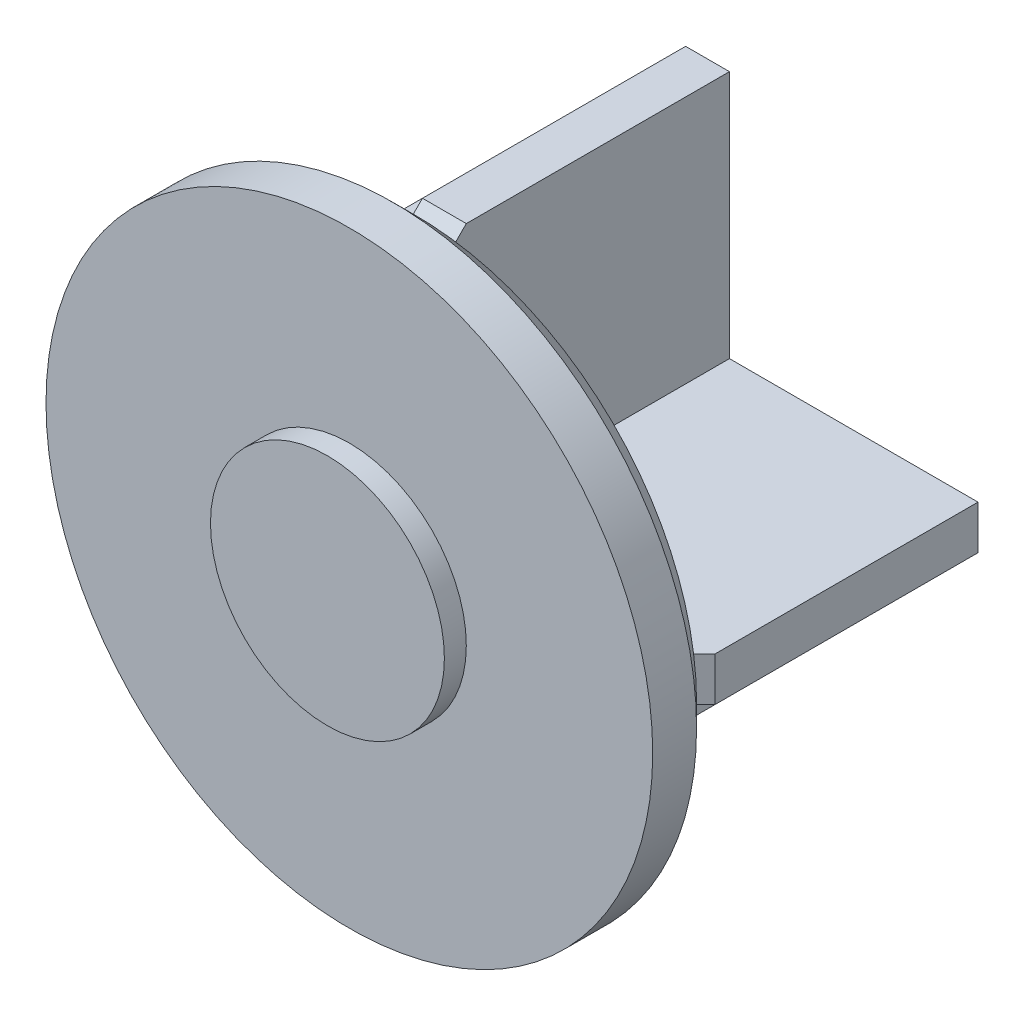
ISO-10303-21;
HEADER;
FILE_DESCRIPTION(('STEP AP214'),'2;1');
FILE_NAME('part.step','',(''),(''),'','','');
FILE_SCHEMA(('AUTOMOTIVE_DESIGN { 1 0 10303 214 1 1 1 1 }'));
ENDSEC;
DATA;
#1=APPLICATION_CONTEXT('core data for automotive mechanical design processes');
#2=APPLICATION_PROTOCOL_DEFINITION('international standard','automotive_design',2000,#1);
#3=PRODUCT_CONTEXT('',#1,'mechanical');
#4=PRODUCT('Part','Part','',(#3));
#5=PRODUCT_RELATED_PRODUCT_CATEGORY('part','',(#4));
#6=PRODUCT_DEFINITION_FORMATION('','',#4);
#7=PRODUCT_DEFINITION_CONTEXT('part definition',#1,'design');
#8=PRODUCT_DEFINITION('design','',#6,#7);
#9=PRODUCT_DEFINITION_SHAPE('','',#8);
#10=(LENGTH_UNIT() NAMED_UNIT(*) SI_UNIT(.MILLI.,.METRE.));
#11=(NAMED_UNIT(*) PLANE_ANGLE_UNIT() SI_UNIT($,.RADIAN.));
#12=(NAMED_UNIT(*) SI_UNIT($,.STERADIAN.) SOLID_ANGLE_UNIT());
#13=UNCERTAINTY_MEASURE_WITH_UNIT(LENGTH_MEASURE(1.E-05),#10,'distance_accuracy_value','');
#14=(GEOMETRIC_REPRESENTATION_CONTEXT(3) GLOBAL_UNCERTAINTY_ASSIGNED_CONTEXT((#13)) GLOBAL_UNIT_ASSIGNED_CONTEXT((#10,
#11,#12)) REPRESENTATION_CONTEXT('',''));
#15=CARTESIAN_POINT('',(0.,0.,0.));
#16=DIRECTION('',(0.,0.,1.));
#17=DIRECTION('',(1.,0.,0.));
#18=AXIS2_PLACEMENT_3D('',#15,#16,#17);
#19=CARTESIAN_POINT('',(0.,0.,-4.5));
#20=DIRECTION('',(0.,0.,1.));
#21=DIRECTION('',(1.,0.,0.));
#22=AXIS2_PLACEMENT_3D('',#19,#20,#21);
#23=PLANE('',#22);
#24=CARTESIAN_POINT('',(0.,0.,-4.5));
#25=DIRECTION('',(0.,0.,1.));
#26=DIRECTION('',(1.,0.,0.));
#27=AXIS2_PLACEMENT_3D('',#24,#25,#26);
#28=CIRCLE('',#27,38.5);
#29=CARTESIAN_POINT('',(38.5,0.,-4.5));
#30=VERTEX_POINT('',#29);
#31=EDGE_CURVE('E227',#30,#30,#28,.F.);
#32=ORIENTED_EDGE('',*,*,#31,.T.);
#33=EDGE_LOOP('',(#32));
#34=FACE_BOUND('',#33,.T.);
#35=DIRECTION('',(-1.,0.,0.));
#36=VECTOR('',#35,1.);
#37=CARTESIAN_POINT('',(41.5,-33.0000000000002,-4.5));
#38=LINE('',#37,#36);
#39=CARTESIAN_POINT('',(3.,-33.,-4.5));
#40=VERTEX_POINT('',#39);
#41=CARTESIAN_POINT('',(-3.,-33.,-4.5));
#42=VERTEX_POINT('',#41);
#43=EDGE_CURVE('E147',#40,#42,#38,.T.);
#44=ORIENTED_EDGE('',*,*,#43,.F.);
#45=DIRECTION('',(0.,-1.,0.));
#46=VECTOR('',#45,1.);
#47=CARTESIAN_POINT('',(3.,-37.,-4.5));
#48=LINE('',#47,#46);
#49=CARTESIAN_POINT('',(3.,-3.,-4.5));
#50=VERTEX_POINT('',#49);
#51=EDGE_CURVE('E161',#50,#40,#48,.T.);
#52=ORIENTED_EDGE('',*,*,#51,.F.);
#53=DIRECTION('',(-1.,0.,0.));
#54=VECTOR('',#53,1.);
#55=CARTESIAN_POINT('',(37.,-3.,-4.5));
#56=LINE('',#55,#54);
#57=CARTESIAN_POINT('',(33.,-3.,-4.5));
#58=VERTEX_POINT('',#57);
#59=EDGE_CURVE('E172',#58,#50,#56,.T.);
#60=ORIENTED_EDGE('',*,*,#59,.F.);
#61=DIRECTION('',(0.,-1.,0.));
#62=VECTOR('',#61,1.);
#63=CARTESIAN_POINT('',(33.,41.5,-4.5));
#64=LINE('',#63,#62);
#65=CARTESIAN_POINT('',(33.,3.,-4.5));
#66=VERTEX_POINT('',#65);
#67=EDGE_CURVE('E278',#66,#58,#64,.T.);
#68=ORIENTED_EDGE('',*,*,#67,.F.);
#69=DIRECTION('',(1.,0.,0.));
#70=VECTOR('',#69,1.);
#71=CARTESIAN_POINT('',(37.,3.,-4.5));
#72=LINE('',#71,#70);
#73=CARTESIAN_POINT('',(3.,3.,-4.5));
#74=VERTEX_POINT('',#73);
#75=EDGE_CURVE('E177',#74,#66,#72,.T.);
#76=ORIENTED_EDGE('',*,*,#75,.F.);
#77=DIRECTION('',(0.,-1.,0.));
#78=VECTOR('',#77,1.);
#79=CARTESIAN_POINT('',(3.,3.,-4.5));
#80=LINE('',#79,#78);
#81=CARTESIAN_POINT('',(3.,33.,-4.5));
#82=VERTEX_POINT('',#81);
#83=EDGE_CURVE('E235',#82,#74,#80,.T.);
#84=ORIENTED_EDGE('',*,*,#83,.F.);
#85=DIRECTION('',(1.,0.,0.));
#86=VECTOR('',#85,1.);
#87=CARTESIAN_POINT('',(-41.5000000000001,33.0000000000005,-4.5));
#88=LINE('',#87,#86);
#89=CARTESIAN_POINT('',(-3.,33.0000000000001,-4.5));
#90=VERTEX_POINT('',#89);
#91=EDGE_CURVE('E55',#90,#82,#88,.T.);
#92=ORIENTED_EDGE('',*,*,#91,.F.);
#93=DIRECTION('',(0.,1.,0.));
#94=VECTOR('',#93,1.);
#95=CARTESIAN_POINT('',(-3.,3.,-4.5));
#96=LINE('',#95,#94);
#97=CARTESIAN_POINT('',(-3.,3.,-4.5));
#98=VERTEX_POINT('',#97);
#99=EDGE_CURVE('E244',#98,#90,#96,.T.);
#100=ORIENTED_EDGE('',*,*,#99,.F.);
#101=DIRECTION('',(1.,0.,0.));
#102=VECTOR('',#101,1.);
#103=CARTESIAN_POINT('',(-3.,3.,-4.5));
#104=LINE('',#103,#102);
#105=CARTESIAN_POINT('',(-33.,3.,-4.5));
#106=VERTEX_POINT('',#105);
#107=EDGE_CURVE('E246',#106,#98,#104,.T.);
#108=ORIENTED_EDGE('',*,*,#107,.F.);
#109=DIRECTION('',(0.,1.,0.));
#110=VECTOR('',#109,1.);
#111=CARTESIAN_POINT('',(-33.,-41.5,-4.5));
#112=LINE('',#111,#110);
#113=CARTESIAN_POINT('',(-33.,-3.,-4.5));
#114=VERTEX_POINT('',#113);
#115=EDGE_CURVE('E48',#114,#106,#112,.T.);
#116=ORIENTED_EDGE('',*,*,#115,.F.);
#117=DIRECTION('',(-1.,0.,0.));
#118=VECTOR('',#117,1.);
#119=CARTESIAN_POINT('',(-3.,-3.,-4.5));
#120=LINE('',#119,#118);
#121=CARTESIAN_POINT('',(-3.,-3.,-4.5));
#122=VERTEX_POINT('',#121);
#123=EDGE_CURVE('E250',#122,#114,#120,.T.);
#124=ORIENTED_EDGE('',*,*,#123,.F.);
#125=DIRECTION('',(0.,1.,0.));
#126=VECTOR('',#125,1.);
#127=CARTESIAN_POINT('',(-3.,-37.,-4.5));
#128=LINE('',#127,#126);
#129=EDGE_CURVE('E164',#42,#122,#128,.T.);
#130=ORIENTED_EDGE('',*,*,#129,.F.);
#131=EDGE_LOOP('',(#44,#52,#60,#68,#76,#84,#92,#100,#108,#116,#124,#130));
#132=FACE_BOUND('',#131,.T.);
#133=ADVANCED_FACE('F33',(#34,#132),#23,.F.);
#134=CARTESIAN_POINT('',(0.,0.,4.5));
#135=DIRECTION('',(0.,0.,1.));
#136=DIRECTION('',(1.,0.,0.));
#137=AXIS2_PLACEMENT_3D('',#134,#135,#136);
#138=PLANE('',#137);
#139=CARTESIAN_POINT('',(0.,0.,4.5));
#140=DIRECTION('',(0.,0.,1.));
#141=DIRECTION('',(1.,0.,0.));
#142=AXIS2_PLACEMENT_3D('',#139,#140,#141);
#143=CIRCLE('',#142,41.5);
#144=CARTESIAN_POINT('',(41.5,0.,4.5));
#145=VERTEX_POINT('',#144);
#146=EDGE_CURVE('E219',#145,#145,#143,.T.);
#147=ORIENTED_EDGE('',*,*,#146,.T.);
#148=EDGE_LOOP('',(#147));
#149=FACE_BOUND('',#148,.T.);
#150=CARTESIAN_POINT('',(0.,0.,4.5));
#151=DIRECTION('',(0.,0.,1.));
#152=DIRECTION('',(1.,0.,0.));
#153=AXIS2_PLACEMENT_3D('',#150,#151,#152);
#154=CIRCLE('',#153,16.);
#155=CARTESIAN_POINT('',(16.,0.,4.5));
#156=VERTEX_POINT('',#155);
#157=EDGE_CURVE('E215',#156,#156,#154,.T.);
#158=ORIENTED_EDGE('',*,*,#157,.F.);
#159=EDGE_LOOP('',(#158));
#160=FACE_BOUND('',#159,.T.);
#161=ADVANCED_FACE('F349',(#149,#160),#138,.T.);
#162=CARTESIAN_POINT('',(0.,0.,4.5));
#163=DIRECTION('',(0.,0.,-1.));
#164=DIRECTION('',(-1.,0.,0.));
#165=AXIS2_PLACEMENT_3D('',#162,#163,#164);
#166=CYLINDRICAL_SURFACE('',#165,41.5);
#167=CARTESIAN_POINT('',(0.,0.,-1.49999999999997));
#168=DIRECTION('',(0.,0.,1.));
#169=DIRECTION('',(1.,0.,0.));
#170=AXIS2_PLACEMENT_3D('',#167,#168,#169);
#171=CIRCLE('',#170,41.5);
#172=CARTESIAN_POINT('',(41.5,0.,-1.49999999999997));
#173=VERTEX_POINT('',#172);
#174=EDGE_CURVE('E224',#173,#173,#171,.T.);
#175=ORIENTED_EDGE('',*,*,#174,.T.);
#176=EDGE_LOOP('',(#175));
#177=FACE_BOUND('',#176,.T.);
#178=ORIENTED_EDGE('',*,*,#146,.F.);
#179=EDGE_LOOP('',(#178));
#180=FACE_BOUND('',#179,.T.);
#181=ADVANCED_FACE('F355',(#177,#180),#166,.T.);
#182=CARTESIAN_POINT('',(0.,0.,-1.49999999999997));
#183=DIRECTION('',(0.,0.,1.));
#184=DIRECTION('',(1.,0.,0.));
#185=AXIS2_PLACEMENT_3D('',#182,#183,#184);
#186=CONICAL_SURFACE('',#185,41.5,0.785398163397448);
#187=ORIENTED_EDGE('',*,*,#31,.F.);
#188=EDGE_LOOP('',(#187));
#189=FACE_BOUND('',#188,.T.);
#190=ORIENTED_EDGE('',*,*,#174,.F.);
#191=EDGE_LOOP('',(#190));
#192=FACE_BOUND('',#191,.T.);
#193=ADVANCED_FACE('F35',(#189,#192),#186,.T.);
#194=CARTESIAN_POINT('',(0.,0.,7.5));
#195=DIRECTION('',(0.,0.,-1.));
#196=DIRECTION('',(-1.,0.,0.));
#197=AXIS2_PLACEMENT_3D('',#194,#195,#196);
#198=CYLINDRICAL_SURFACE('',#197,16.);
#199=CARTESIAN_POINT('',(0.,0.,7.5));
#200=DIRECTION('',(0.,0.,1.));
#201=DIRECTION('',(1.,0.,0.));
#202=AXIS2_PLACEMENT_3D('',#199,#200,#201);
#203=CIRCLE('',#202,16.);
#204=CARTESIAN_POINT('',(16.,0.,7.5));
#205=VERTEX_POINT('',#204);
#206=EDGE_CURVE('E216',#205,#205,#203,.T.);
#207=ORIENTED_EDGE('',*,*,#206,.F.);
#208=EDGE_LOOP('',(#207));
#209=FACE_BOUND('',#208,.T.);
#210=ORIENTED_EDGE('',*,*,#157,.T.);
#211=EDGE_LOOP('',(#210));
#212=FACE_BOUND('',#211,.T.);
#213=ADVANCED_FACE('F364',(#209,#212),#198,.T.);
#214=CARTESIAN_POINT('',(0.,0.,7.5));
#215=DIRECTION('',(0.,0.,1.));
#216=DIRECTION('',(1.,0.,0.));
#217=AXIS2_PLACEMENT_3D('',#214,#215,#216);
#218=PLANE('',#217);
#219=ORIENTED_EDGE('',*,*,#206,.T.);
#220=EDGE_LOOP('',(#219));
#221=FACE_BOUND('',#220,.T.);
#222=ADVANCED_FACE('F373',(#221),#218,.T.);
#223=CARTESIAN_POINT('',(3.,-37.,-44.5));
#224=DIRECTION('',(0.,1.,0.));
#225=DIRECTION('',(0.,0.,1.));
#226=AXIS2_PLACEMENT_3D('',#223,#224,#225);
#227=PLANE('',#226);
#228=DIRECTION('',(0.,0.,1.));
#229=VECTOR('',#228,1.);
#230=CARTESIAN_POINT('',(3.,-37.,-44.5));
#231=LINE('',#230,#229);
#232=CARTESIAN_POINT('',(3.,-37.,-44.5));
#233=VERTEX_POINT('',#232);
#234=CARTESIAN_POINT('',(3.,-37.,-8.5));
#235=VERTEX_POINT('',#234);
#236=EDGE_CURVE('E181',#233,#235,#231,.T.);
#237=ORIENTED_EDGE('',*,*,#236,.T.);
#238=DIRECTION('',(-1.,0.,0.));
#239=VECTOR('',#238,1.);
#240=CARTESIAN_POINT('',(41.5,-37.0000000000001,-8.5));
#241=LINE('',#240,#239);
#242=CARTESIAN_POINT('',(-3.,-37.,-8.5));
#243=VERTEX_POINT('',#242);
#244=EDGE_CURVE('E150',#235,#243,#241,.T.);
#245=ORIENTED_EDGE('',*,*,#244,.T.);
#246=DIRECTION('',(0.,0.,1.));
#247=VECTOR('',#246,1.);
#248=CARTESIAN_POINT('',(-3.,-37.,-44.5));
#249=LINE('',#248,#247);
#250=CARTESIAN_POINT('',(-3.,-37.,-44.5));
#251=VERTEX_POINT('',#250);
#252=EDGE_CURVE('E212',#251,#243,#249,.T.);
#253=ORIENTED_EDGE('',*,*,#252,.F.);
#254=DIRECTION('',(-1.,0.,0.));
#255=VECTOR('',#254,1.);
#256=CARTESIAN_POINT('',(3.,-37.,-44.5));
#257=LINE('',#256,#255);
#258=EDGE_CURVE('E171',#233,#251,#257,.T.);
#259=ORIENTED_EDGE('',*,*,#258,.F.);
#260=EDGE_LOOP('',(#237,#245,#253,#259));
#261=FACE_BOUND('',#260,.T.);
#262=ADVANCED_FACE('F323',(#261),#227,.F.);
#263=CARTESIAN_POINT('',(-3.,-37.,-44.5));
#264=DIRECTION('',(1.,0.,0.));
#265=DIRECTION('',(0.,0.,-1.));
#266=AXIS2_PLACEMENT_3D('',#263,#264,#265);
#267=PLANE('',#266);
#268=ORIENTED_EDGE('',*,*,#252,.T.);
#269=DIRECTION('',(0.,0.707106781186544,0.707106781186551));
#270=VECTOR('',#269,1.);
#271=CARTESIAN_POINT('',(-3.,-55.,-26.5000000000002));
#272=LINE('',#271,#270);
#273=EDGE_CURVE('E288',#243,#42,#272,.T.);
#274=ORIENTED_EDGE('',*,*,#273,.T.);
#275=ORIENTED_EDGE('',*,*,#129,.T.);
#276=DIRECTION('',(0.,0.,1.));
#277=VECTOR('',#276,1.);
#278=CARTESIAN_POINT('',(-3.,-3.,-44.5));
#279=LINE('',#278,#277);
#280=CARTESIAN_POINT('',(-3.,-3.,-44.5));
#281=VERTEX_POINT('',#280);
#282=EDGE_CURVE('E209',#281,#122,#279,.T.);
#283=ORIENTED_EDGE('',*,*,#282,.F.);
#284=DIRECTION('',(0.,1.,0.));
#285=VECTOR('',#284,1.);
#286=CARTESIAN_POINT('',(-3.,-37.,-44.5));
#287=LINE('',#286,#285);
#288=EDGE_CURVE('E175',#251,#281,#287,.T.);
#289=ORIENTED_EDGE('',*,*,#288,.F.);
#290=EDGE_LOOP('',(#268,#274,#275,#283,#289));
#291=FACE_BOUND('',#290,.T.);
#292=ADVANCED_FACE('F320',(#291),#267,.F.);
#293=CARTESIAN_POINT('',(-3.,-3.,-44.5));
#294=DIRECTION('',(0.,1.,0.));
#295=DIRECTION('',(-1.,0.,0.));
#296=AXIS2_PLACEMENT_3D('',#293,#294,#295);
#297=PLANE('',#296);
#298=ORIENTED_EDGE('',*,*,#123,.T.);
#299=DIRECTION('',(-0.707106781186544,0.,-0.707106781186551));
#300=VECTOR('',#299,1.);
#301=CARTESIAN_POINT('',(-38.0000000000002,-3.,-9.50000000000017));
#302=LINE('',#301,#300);
#303=CARTESIAN_POINT('',(-37.,-3.,-8.5));
#304=VERTEX_POINT('',#303);
#305=EDGE_CURVE('E280',#114,#304,#302,.T.);
#306=ORIENTED_EDGE('',*,*,#305,.T.);
#307=DIRECTION('',(0.,0.,1.));
#308=VECTOR('',#307,1.);
#309=CARTESIAN_POINT('',(-37.,-3.,-44.5));
#310=LINE('',#309,#308);
#311=CARTESIAN_POINT('',(-37.,-3.,-44.5));
#312=VERTEX_POINT('',#311);
#313=EDGE_CURVE('E206',#312,#304,#310,.T.);
#314=ORIENTED_EDGE('',*,*,#313,.F.);
#315=DIRECTION('',(-1.,0.,0.));
#316=VECTOR('',#315,1.);
#317=CARTESIAN_POINT('',(-3.,-3.,-44.5));
#318=LINE('',#317,#316);
#319=EDGE_CURVE('E272',#281,#312,#318,.T.);
#320=ORIENTED_EDGE('',*,*,#319,.F.);
#321=ORIENTED_EDGE('',*,*,#282,.T.);
#322=EDGE_LOOP('',(#298,#306,#314,#320,#321));
#323=FACE_BOUND('',#322,.T.);
#324=ADVANCED_FACE('F317',(#323),#297,.F.);
#325=CARTESIAN_POINT('',(-37.,3.,-44.5));
#326=DIRECTION('',(1.,0.,0.));
#327=DIRECTION('',(0.,0.,-1.));
#328=AXIS2_PLACEMENT_3D('',#325,#326,#327);
#329=PLANE('',#328);
#330=ORIENTED_EDGE('',*,*,#313,.T.);
#331=DIRECTION('',(0.,1.,0.));
#332=VECTOR('',#331,1.);
#333=CARTESIAN_POINT('',(-37.,-41.5,-8.5));
#334=LINE('',#333,#332);
#335=CARTESIAN_POINT('',(-37.,3.,-8.5));
#336=VERTEX_POINT('',#335);
#337=EDGE_CURVE('E165',#304,#336,#334,.T.);
#338=ORIENTED_EDGE('',*,*,#337,.T.);
#339=DIRECTION('',(0.,0.,1.));
#340=VECTOR('',#339,1.);
#341=CARTESIAN_POINT('',(-37.,3.,-44.5));
#342=LINE('',#341,#340);
#343=CARTESIAN_POINT('',(-37.,3.,-44.5));
#344=VERTEX_POINT('',#343);
#345=EDGE_CURVE('E203',#344,#336,#342,.T.);
#346=ORIENTED_EDGE('',*,*,#345,.F.);
#347=DIRECTION('',(0.,1.,0.));
#348=VECTOR('',#347,1.);
#349=CARTESIAN_POINT('',(-37.,3.,-44.5));
#350=LINE('',#349,#348);
#351=EDGE_CURVE('E270',#312,#344,#350,.T.);
#352=ORIENTED_EDGE('',*,*,#351,.F.);
#353=EDGE_LOOP('',(#330,#338,#346,#352));
#354=FACE_BOUND('',#353,.T.);
#355=ADVANCED_FACE('F312',(#354),#329,.F.);
#356=CARTESIAN_POINT('',(-3.,3.,-44.5));
#357=DIRECTION('',(0.,-1.,0.));
#358=DIRECTION('',(1.,0.,0.));
#359=AXIS2_PLACEMENT_3D('',#356,#357,#358);
#360=PLANE('',#359);
#361=ORIENTED_EDGE('',*,*,#345,.T.);
#362=DIRECTION('',(0.707106781186544,0.,0.707106781186551));
#363=VECTOR('',#362,1.);
#364=CARTESIAN_POINT('',(-38.0000000000002,3.,-9.50000000000017));
#365=LINE('',#364,#363);
#366=EDGE_CURVE('E11',#336,#106,#365,.T.);
#367=ORIENTED_EDGE('',*,*,#366,.T.);
#368=ORIENTED_EDGE('',*,*,#107,.T.);
#369=DIRECTION('',(0.,0.,1.));
#370=VECTOR('',#369,1.);
#371=CARTESIAN_POINT('',(-3.,3.,-44.5));
#372=LINE('',#371,#370);
#373=CARTESIAN_POINT('',(-3.,3.,-44.5));
#374=VERTEX_POINT('',#373);
#375=EDGE_CURVE('E200',#374,#98,#372,.T.);
#376=ORIENTED_EDGE('',*,*,#375,.F.);
#377=DIRECTION('',(1.,0.,0.));
#378=VECTOR('',#377,1.);
#379=CARTESIAN_POINT('',(-3.,3.,-44.5));
#380=LINE('',#379,#378);
#381=EDGE_CURVE('E268',#344,#374,#380,.T.);
#382=ORIENTED_EDGE('',*,*,#381,.F.);
#383=EDGE_LOOP('',(#361,#367,#368,#376,#382));
#384=FACE_BOUND('',#383,.T.);
#385=ADVANCED_FACE('F307',(#384),#360,.F.);
#386=CARTESIAN_POINT('',(-3.,3.,-44.5));
#387=DIRECTION('',(1.,0.,0.));
#388=DIRECTION('',(0.,0.,-1.));
#389=AXIS2_PLACEMENT_3D('',#386,#387,#388);
#390=PLANE('',#389);
#391=ORIENTED_EDGE('',*,*,#99,.T.);
#392=DIRECTION('',(0.,0.707106781186544,-0.707106781186551));
#393=VECTOR('',#392,1.);
#394=CARTESIAN_POINT('',(-3.,38.0000000000002,-9.50000000000015));
#395=LINE('',#394,#393);
#396=CARTESIAN_POINT('',(-3.,37.,-8.5));
#397=VERTEX_POINT('',#396);
#398=EDGE_CURVE('E285',#90,#397,#395,.T.);
#399=ORIENTED_EDGE('',*,*,#398,.T.);
#400=DIRECTION('',(0.,0.,1.));
#401=VECTOR('',#400,1.);
#402=CARTESIAN_POINT('',(-3.,37.,-44.5));
#403=LINE('',#402,#401);
#404=CARTESIAN_POINT('',(-3.,37.,-44.5));
#405=VERTEX_POINT('',#404);
#406=EDGE_CURVE('E197',#405,#397,#403,.T.);
#407=ORIENTED_EDGE('',*,*,#406,.F.);
#408=DIRECTION('',(0.,1.,0.));
#409=VECTOR('',#408,1.);
#410=CARTESIAN_POINT('',(-3.,3.,-44.5));
#411=LINE('',#410,#409);
#412=EDGE_CURVE('E266',#374,#405,#411,.T.);
#413=ORIENTED_EDGE('',*,*,#412,.F.);
#414=ORIENTED_EDGE('',*,*,#375,.T.);
#415=EDGE_LOOP('',(#391,#399,#407,#413,#414));
#416=FACE_BOUND('',#415,.T.);
#417=ADVANCED_FACE('F302',(#416),#390,.F.);
#418=CARTESIAN_POINT('',(3.,37.,-44.5));
#419=DIRECTION('',(0.,-1.,0.));
#420=DIRECTION('',(0.,0.,-1.));
#421=AXIS2_PLACEMENT_3D('',#418,#419,#420);
#422=PLANE('',#421);
#423=ORIENTED_EDGE('',*,*,#406,.T.);
#424=DIRECTION('',(1.,0.,0.));
#425=VECTOR('',#424,1.);
#426=CARTESIAN_POINT('',(-41.5,37.0000000000004,-8.5));
#427=LINE('',#426,#425);
#428=CARTESIAN_POINT('',(3.,37.,-8.5));
#429=VERTEX_POINT('',#428);
#430=EDGE_CURVE('E292',#397,#429,#427,.T.);
#431=ORIENTED_EDGE('',*,*,#430,.T.);
#432=DIRECTION('',(0.,0.,1.));
#433=VECTOR('',#432,1.);
#434=CARTESIAN_POINT('',(3.,37.,-44.5));
#435=LINE('',#434,#433);
#436=CARTESIAN_POINT('',(3.,37.,-44.5));
#437=VERTEX_POINT('',#436);
#438=EDGE_CURVE('E194',#437,#429,#435,.T.);
#439=ORIENTED_EDGE('',*,*,#438,.F.);
#440=DIRECTION('',(1.,0.,0.));
#441=VECTOR('',#440,1.);
#442=CARTESIAN_POINT('',(3.,37.,-44.5));
#443=LINE('',#442,#441);
#444=EDGE_CURVE('E264',#405,#437,#443,.T.);
#445=ORIENTED_EDGE('',*,*,#444,.F.);
#446=EDGE_LOOP('',(#423,#431,#439,#445));
#447=FACE_BOUND('',#446,.T.);
#448=ADVANCED_FACE('F297',(#447),#422,.F.);
#449=CARTESIAN_POINT('',(3.,3.,-44.5));
#450=DIRECTION('',(-1.,0.,0.));
#451=DIRECTION('',(0.,-1.,0.));
#452=AXIS2_PLACEMENT_3D('',#449,#450,#451);
#453=PLANE('',#452);
#454=ORIENTED_EDGE('',*,*,#438,.T.);
#455=DIRECTION('',(0.,-0.707106781186544,0.707106781186551));
#456=VECTOR('',#455,1.);
#457=CARTESIAN_POINT('',(3.,38.0000000000001,-9.50000000000019));
#458=LINE('',#457,#456);
#459=EDGE_CURVE('E41',#429,#82,#458,.T.);
#460=ORIENTED_EDGE('',*,*,#459,.T.);
#461=ORIENTED_EDGE('',*,*,#83,.T.);
#462=DIRECTION('',(0.,0.,1.));
#463=VECTOR('',#462,1.);
#464=CARTESIAN_POINT('',(3.,3.,-44.5));
#465=LINE('',#464,#463);
#466=CARTESIAN_POINT('',(3.,3.,-44.5));
#467=VERTEX_POINT('',#466);
#468=EDGE_CURVE('E191',#467,#74,#465,.T.);
#469=ORIENTED_EDGE('',*,*,#468,.F.);
#470=DIRECTION('',(0.,-1.,0.));
#471=VECTOR('',#470,1.);
#472=CARTESIAN_POINT('',(3.,3.,-44.5));
#473=LINE('',#472,#471);
#474=EDGE_CURVE('E262',#437,#467,#473,.T.);
#475=ORIENTED_EDGE('',*,*,#474,.F.);
#476=EDGE_LOOP('',(#454,#460,#461,#469,#475));
#477=FACE_BOUND('',#476,.T.);
#478=ADVANCED_FACE('F233',(#477),#453,.F.);
#479=CARTESIAN_POINT('',(37.,3.,-44.5));
#480=DIRECTION('',(0.,-1.,0.));
#481=DIRECTION('',(1.,0.,0.));
#482=AXIS2_PLACEMENT_3D('',#479,#480,#481);
#483=PLANE('',#482);
#484=ORIENTED_EDGE('',*,*,#75,.T.);
#485=DIRECTION('',(0.707106781186544,0.,-0.707106781186551));
#486=VECTOR('',#485,1.);
#487=CARTESIAN_POINT('',(55.,3.,-26.5000000000002));
#488=LINE('',#487,#486);
#489=CARTESIAN_POINT('',(37.,3.,-8.5));
#490=VERTEX_POINT('',#489);
#491=EDGE_CURVE('E254',#66,#490,#488,.T.);
#492=ORIENTED_EDGE('',*,*,#491,.T.);
#493=DIRECTION('',(0.,0.,1.));
#494=VECTOR('',#493,1.);
#495=CARTESIAN_POINT('',(37.,3.,-44.5));
#496=LINE('',#495,#494);
#497=CARTESIAN_POINT('',(37.,3.,-44.5));
#498=VERTEX_POINT('',#497);
#499=EDGE_CURVE('E188',#498,#490,#496,.T.);
#500=ORIENTED_EDGE('',*,*,#499,.F.);
#501=DIRECTION('',(1.,0.,0.));
#502=VECTOR('',#501,1.);
#503=CARTESIAN_POINT('',(37.,3.,-44.5));
#504=LINE('',#503,#502);
#505=EDGE_CURVE('E260',#467,#498,#504,.T.);
#506=ORIENTED_EDGE('',*,*,#505,.F.);
#507=ORIENTED_EDGE('',*,*,#468,.T.);
#508=EDGE_LOOP('',(#484,#492,#500,#506,#507));
#509=FACE_BOUND('',#508,.T.);
#510=ADVANCED_FACE('F334',(#509),#483,.F.);
#511=CARTESIAN_POINT('',(37.,3.,-44.5));
#512=DIRECTION('',(-1.,0.,0.));
#513=DIRECTION('',(0.,0.,1.));
#514=AXIS2_PLACEMENT_3D('',#511,#512,#513);
#515=PLANE('',#514);
#516=ORIENTED_EDGE('',*,*,#499,.T.);
#517=DIRECTION('',(0.,-1.,0.));
#518=VECTOR('',#517,1.);
#519=CARTESIAN_POINT('',(37.,41.5,-8.5));
#520=LINE('',#519,#518);
#521=CARTESIAN_POINT('',(37.,-3.,-8.5));
#522=VERTEX_POINT('',#521);
#523=EDGE_CURVE('E277',#490,#522,#520,.T.);
#524=ORIENTED_EDGE('',*,*,#523,.T.);
#525=DIRECTION('',(0.,0.,1.));
#526=VECTOR('',#525,1.);
#527=CARTESIAN_POINT('',(37.,-3.,-44.5));
#528=LINE('',#527,#526);
#529=CARTESIAN_POINT('',(37.,-3.,-44.5));
#530=VERTEX_POINT('',#529);
#531=EDGE_CURVE('E185',#530,#522,#528,.T.);
#532=ORIENTED_EDGE('',*,*,#531,.F.);
#533=DIRECTION('',(0.,-1.,0.));
#534=VECTOR('',#533,1.);
#535=CARTESIAN_POINT('',(37.,3.,-44.5));
#536=LINE('',#535,#534);
#537=EDGE_CURVE('E258',#498,#530,#536,.T.);
#538=ORIENTED_EDGE('',*,*,#537,.F.);
#539=EDGE_LOOP('',(#516,#524,#532,#538));
#540=FACE_BOUND('',#539,.T.);
#541=ADVANCED_FACE('F338',(#540),#515,.F.);
#542=CARTESIAN_POINT('',(37.,-3.,-44.5));
#543=DIRECTION('',(0.,1.,0.));
#544=DIRECTION('',(-1.,0.,0.));
#545=AXIS2_PLACEMENT_3D('',#542,#543,#544);
#546=PLANE('',#545);
#547=ORIENTED_EDGE('',*,*,#531,.T.);
#548=DIRECTION('',(-0.707106781186544,0.,0.707106781186551));
#549=VECTOR('',#548,1.);
#550=CARTESIAN_POINT('',(55.,-3.,-26.5000000000002));
#551=LINE('',#550,#549);
#552=EDGE_CURVE('E155',#522,#58,#551,.T.);
#553=ORIENTED_EDGE('',*,*,#552,.T.);
#554=ORIENTED_EDGE('',*,*,#59,.T.);
#555=DIRECTION('',(0.,0.,1.));
#556=VECTOR('',#555,1.);
#557=CARTESIAN_POINT('',(3.,-3.,-44.5));
#558=LINE('',#557,#556);
#559=CARTESIAN_POINT('',(3.,-3.,-44.5));
#560=VERTEX_POINT('',#559);
#561=EDGE_CURVE('E170',#560,#50,#558,.T.);
#562=ORIENTED_EDGE('',*,*,#561,.F.);
#563=DIRECTION('',(-1.,0.,0.));
#564=VECTOR('',#563,1.);
#565=CARTESIAN_POINT('',(37.,-3.,-44.5));
#566=LINE('',#565,#564);
#567=EDGE_CURVE('E256',#530,#560,#566,.T.);
#568=ORIENTED_EDGE('',*,*,#567,.F.);
#569=EDGE_LOOP('',(#547,#553,#554,#562,#568));
#570=FACE_BOUND('',#569,.T.);
#571=ADVANCED_FACE('F331',(#570),#546,.F.);
#572=CARTESIAN_POINT('',(3.,-37.,-44.5));
#573=DIRECTION('',(-1.,0.,0.));
#574=DIRECTION('',(0.,-1.,0.));
#575=AXIS2_PLACEMENT_3D('',#572,#573,#574);
#576=PLANE('',#575);
#577=ORIENTED_EDGE('',*,*,#51,.T.);
#578=DIRECTION('',(0.,-0.707106781186544,-0.707106781186551));
#579=VECTOR('',#578,1.);
#580=CARTESIAN_POINT('',(3.,-55.,-26.5000000000002));
#581=LINE('',#580,#579);
#582=EDGE_CURVE('E144',#40,#235,#581,.T.);
#583=ORIENTED_EDGE('',*,*,#582,.T.);
#584=ORIENTED_EDGE('',*,*,#236,.F.);
#585=DIRECTION('',(0.,-1.,0.));
#586=VECTOR('',#585,1.);
#587=CARTESIAN_POINT('',(3.,-37.,-44.5));
#588=LINE('',#587,#586);
#589=EDGE_CURVE('E183',#560,#233,#588,.T.);
#590=ORIENTED_EDGE('',*,*,#589,.F.);
#591=ORIENTED_EDGE('',*,*,#561,.T.);
#592=EDGE_LOOP('',(#577,#583,#584,#590,#591));
#593=FACE_BOUND('',#592,.T.);
#594=ADVANCED_FACE('F167',(#593),#576,.F.);
#595=CARTESIAN_POINT('',(0.,0.,-44.5));
#596=DIRECTION('',(0.,0.,-1.));
#597=DIRECTION('',(-1.,0.,0.));
#598=AXIS2_PLACEMENT_3D('',#595,#596,#597);
#599=PLANE('',#598);
#600=ORIENTED_EDGE('',*,*,#258,.T.);
#601=ORIENTED_EDGE('',*,*,#288,.T.);
#602=ORIENTED_EDGE('',*,*,#319,.T.);
#603=ORIENTED_EDGE('',*,*,#351,.T.);
#604=ORIENTED_EDGE('',*,*,#381,.T.);
#605=ORIENTED_EDGE('',*,*,#412,.T.);
#606=ORIENTED_EDGE('',*,*,#444,.T.);
#607=ORIENTED_EDGE('',*,*,#474,.T.);
#608=ORIENTED_EDGE('',*,*,#505,.T.);
#609=ORIENTED_EDGE('',*,*,#537,.T.);
#610=ORIENTED_EDGE('',*,*,#567,.T.);
#611=ORIENTED_EDGE('',*,*,#589,.T.);
#612=EDGE_LOOP('',(#600,#601,#602,#603,#604,#605,#606,#607,#608,#609,#610,#611));
#613=FACE_BOUND('',#612,.T.);
#614=ADVANCED_FACE('F326',(#613),#599,.T.);
#615=CARTESIAN_POINT('',(37.,41.5,-8.5));
#616=DIRECTION('',(-0.707106781186551,0.,-0.707106781186544));
#617=DIRECTION('',(-0.707106781186544,0.,0.707106781186551));
#618=AXIS2_PLACEMENT_3D('',#615,#616,#617);
#619=PLANE('',#618);
#620=ORIENTED_EDGE('',*,*,#67,.T.);
#621=ORIENTED_EDGE('',*,*,#552,.F.);
#622=ORIENTED_EDGE('',*,*,#523,.F.);
#623=ORIENTED_EDGE('',*,*,#491,.F.);
#624=EDGE_LOOP('',(#620,#621,#622,#623));
#625=FACE_BOUND('',#624,.T.);
#626=ADVANCED_FACE('F339',(#625),#619,.F.);
#627=CARTESIAN_POINT('',(41.5,-37.0000000000001,-8.5));
#628=DIRECTION('',(0.,0.707106781186551,-0.707106781186544));
#629=DIRECTION('',(0.,0.707106781186544,0.707106781186551));
#630=AXIS2_PLACEMENT_3D('',#627,#628,#629);
#631=PLANE('',#630);
#632=ORIENTED_EDGE('',*,*,#244,.F.);
#633=ORIENTED_EDGE('',*,*,#582,.F.);
#634=ORIENTED_EDGE('',*,*,#43,.T.);
#635=ORIENTED_EDGE('',*,*,#273,.F.);
#636=EDGE_LOOP('',(#632,#633,#634,#635));
#637=FACE_BOUND('',#636,.T.);
#638=ADVANCED_FACE('F146',(#637),#631,.F.);
#639=CARTESIAN_POINT('',(-41.5,37.0000000000004,-8.5));
#640=DIRECTION('',(0.,-0.707106781186551,-0.707106781186544));
#641=DIRECTION('',(0.,0.707106781186544,-0.707106781186551));
#642=AXIS2_PLACEMENT_3D('',#639,#640,#641);
#643=PLANE('',#642);
#644=ORIENTED_EDGE('',*,*,#91,.T.);
#645=ORIENTED_EDGE('',*,*,#459,.F.);
#646=ORIENTED_EDGE('',*,*,#430,.F.);
#647=ORIENTED_EDGE('',*,*,#398,.F.);
#648=EDGE_LOOP('',(#644,#645,#646,#647));
#649=FACE_BOUND('',#648,.T.);
#650=ADVANCED_FACE('F300',(#649),#643,.F.);
#651=CARTESIAN_POINT('',(-37.,-41.5,-8.5));
#652=DIRECTION('',(0.707106781186551,0.,-0.707106781186544));
#653=DIRECTION('',(-0.707106781186544,0.,-0.707106781186551));
#654=AXIS2_PLACEMENT_3D('',#651,#652,#653);
#655=PLANE('',#654);
#656=ORIENTED_EDGE('',*,*,#115,.T.);
#657=ORIENTED_EDGE('',*,*,#366,.F.);
#658=ORIENTED_EDGE('',*,*,#337,.F.);
#659=ORIENTED_EDGE('',*,*,#305,.F.);
#660=EDGE_LOOP('',(#656,#657,#658,#659));
#661=FACE_BOUND('',#660,.T.);
#662=ADVANCED_FACE('F310',(#661),#655,.F.);
#663=CLOSED_SHELL('',(#133,#161,#181,#193,#213,#222,#262,#292,#324,#355,#385,#417,#448,#478,
#510,#541,#571,#594,#614,#626,#638,#650,#662));
#664=MANIFOLD_SOLID_BREP('B2',#663);
#665=ADVANCED_BREP_SHAPE_REPRESENTATION('',(#18,#664),#14);
#666=SHAPE_DEFINITION_REPRESENTATION(#9,#665);
ENDSEC;
END-ISO-10303-21;
